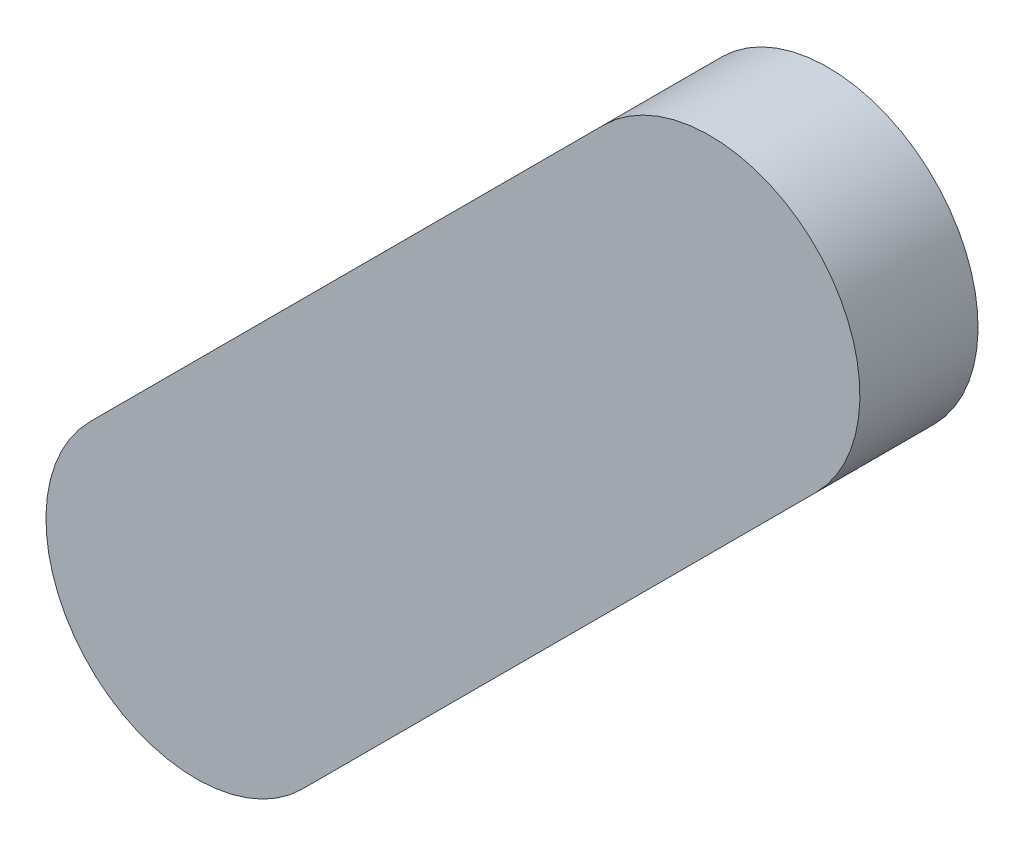
ISO-10303-21;
HEADER;
FILE_DESCRIPTION(('STEP AP214'),'2;1');
FILE_NAME('part.step','',(''),(''),'','','');
FILE_SCHEMA(('AUTOMOTIVE_DESIGN { 1 0 10303 214 1 1 1 1 }'));
ENDSEC;
DATA;
#1=APPLICATION_CONTEXT('core data for automotive mechanical design processes');
#2=APPLICATION_PROTOCOL_DEFINITION('international standard','automotive_design',2000,#1);
#3=PRODUCT_CONTEXT('',#1,'mechanical');
#4=PRODUCT('Part','Part','',(#3));
#5=PRODUCT_RELATED_PRODUCT_CATEGORY('part','',(#4));
#6=PRODUCT_DEFINITION_FORMATION('','',#4);
#7=PRODUCT_DEFINITION_CONTEXT('part definition',#1,'design');
#8=PRODUCT_DEFINITION('design','',#6,#7);
#9=PRODUCT_DEFINITION_SHAPE('','',#8);
#10=(LENGTH_UNIT() NAMED_UNIT(*) SI_UNIT(.MILLI.,.METRE.));
#11=(NAMED_UNIT(*) PLANE_ANGLE_UNIT() SI_UNIT($,.RADIAN.));
#12=(NAMED_UNIT(*) SI_UNIT($,.STERADIAN.) SOLID_ANGLE_UNIT());
#13=UNCERTAINTY_MEASURE_WITH_UNIT(LENGTH_MEASURE(1.E-05),#10,'distance_accuracy_value','');
#14=(GEOMETRIC_REPRESENTATION_CONTEXT(3) GLOBAL_UNCERTAINTY_ASSIGNED_CONTEXT((#13)) GLOBAL_UNIT_ASSIGNED_CONTEXT((#10,
#11,#12)) REPRESENTATION_CONTEXT('',''));
#15=CARTESIAN_POINT('',(0.,0.,0.));
#16=DIRECTION('',(0.,0.,1.));
#17=DIRECTION('',(1.,0.,0.));
#18=AXIS2_PLACEMENT_3D('',#15,#16,#17);
#19=CARTESIAN_POINT('',(108.76460594,57.98639406,0.));
#20=DIRECTION('',(-0.707106781186545,0.707106781186551,0.));
#21=DIRECTION('',(0.707106781186551,0.707106781186545,0.));
#22=AXIS2_PLACEMENT_3D('',#19,#20,#21);
#23=PLANE('',#22);
#24=DIRECTION('',(0.707106781186551,0.707106781186545,0.));
#25=VECTOR('',#24,1.);
#26=CARTESIAN_POINT('',(108.76460594,57.98639406,0.1999996));
#27=LINE('',#26,#25);
#28=CARTESIAN_POINT('',(108.76460594,57.98639406,0.1999996));
#29=VERTEX_POINT('',#28);
#30=CARTESIAN_POINT('',(109.63460674,58.85639486,0.1999996));
#31=VERTEX_POINT('',#30);
#32=EDGE_CURVE('E11',#29,#31,#27,.T.);
#33=ORIENTED_EDGE('',*,*,#32,.F.);
#34=DIRECTION('',(0.,0.,1.));
#35=VECTOR('',#34,1.);
#36=CARTESIAN_POINT('',(108.76460594,57.98639406,0.));
#37=LINE('',#36,#35);
#38=CARTESIAN_POINT('',(108.76460594,57.98639406,0.));
#39=VERTEX_POINT('',#38);
#40=EDGE_CURVE('E24',#39,#29,#37,.T.);
#41=ORIENTED_EDGE('',*,*,#40,.F.);
#42=DIRECTION('',(0.707106781186551,0.707106781186545,0.));
#43=VECTOR('',#42,1.);
#44=CARTESIAN_POINT('',(108.76460594,57.98639406,0.));
#45=LINE('',#44,#43);
#46=CARTESIAN_POINT('',(109.63460674,58.85639486,0.));
#47=VERTEX_POINT('',#46);
#48=EDGE_CURVE('E75',#39,#47,#45,.T.);
#49=ORIENTED_EDGE('',*,*,#48,.T.);
#50=DIRECTION('',(0.,0.,1.));
#51=VECTOR('',#50,1.);
#52=CARTESIAN_POINT('',(109.63460674,58.85639486,0.));
#53=LINE('',#52,#51);
#54=EDGE_CURVE('E37',#47,#31,#53,.T.);
#55=ORIENTED_EDGE('',*,*,#54,.T.);
#56=EDGE_LOOP('',(#33,#41,#49,#55));
#57=FACE_BOUND('',#56,.T.);
#58=ADVANCED_FACE('F17',(#57),#23,.F.);
#59=CARTESIAN_POINT('',(109.4550008,59.0360008,0.));
#60=DIRECTION('',(0.,0.,-1.));
#61=DIRECTION('',(0.707106781186562,-0.707106781186534,0.));
#62=AXIS2_PLACEMENT_3D('',#59,#60,#61);
#63=CYLINDRICAL_SURFACE('',#62,0.254001156230766);
#64=CARTESIAN_POINT('',(109.4550008,59.0360008,0.1999996));
#65=DIRECTION('',(0.,0.,1.));
#66=DIRECTION('',(0.707106781186562,-0.707106781186534,0.));
#67=AXIS2_PLACEMENT_3D('',#64,#65,#66);
#68=CIRCLE('',#67,0.254001156230766);
#69=CARTESIAN_POINT('',(109.27539486,59.21560674,0.1999996));
#70=VERTEX_POINT('',#69);
#71=EDGE_CURVE('E83',#31,#70,#68,.T.);
#72=ORIENTED_EDGE('',*,*,#71,.F.);
#73=ORIENTED_EDGE('',*,*,#54,.F.);
#74=CARTESIAN_POINT('',(109.4550008,59.0360008,0.));
#75=DIRECTION('',(0.,0.,1.));
#76=DIRECTION('',(0.707106781186562,-0.707106781186534,0.));
#77=AXIS2_PLACEMENT_3D('',#74,#75,#76);
#78=CIRCLE('',#77,0.254001156230766);
#79=CARTESIAN_POINT('',(109.27539486,59.21560674,0.));
#80=VERTEX_POINT('',#79);
#81=EDGE_CURVE('E81',#47,#80,#78,.T.);
#82=ORIENTED_EDGE('',*,*,#81,.T.);
#83=DIRECTION('',(0.,0.,1.));
#84=VECTOR('',#83,1.);
#85=CARTESIAN_POINT('',(109.27539486,59.21560674,0.));
#86=LINE('',#85,#84);
#87=EDGE_CURVE('E67',#80,#70,#86,.T.);
#88=ORIENTED_EDGE('',*,*,#87,.T.);
#89=EDGE_LOOP('',(#72,#73,#82,#88));
#90=FACE_BOUND('',#89,.T.);
#91=ADVANCED_FACE('F89',(#90),#63,.T.);
#92=CARTESIAN_POINT('',(109.27539486,59.21560674,0.));
#93=DIRECTION('',(0.707106781186536,-0.707106781186559,0.));
#94=DIRECTION('',(-0.707106781186559,-0.707106781186536,0.));
#95=AXIS2_PLACEMENT_3D('',#92,#93,#94);
#96=PLANE('',#95);
#97=DIRECTION('',(-0.707106781186559,-0.707106781186536,0.));
#98=VECTOR('',#97,1.);
#99=CARTESIAN_POINT('',(109.27539486,59.21560674,0.1999996));
#100=LINE('',#99,#98);
#101=CARTESIAN_POINT('',(108.40539406,58.34560594,0.1999996));
#102=VERTEX_POINT('',#101);
#103=EDGE_CURVE('E71',#70,#102,#100,.T.);
#104=ORIENTED_EDGE('',*,*,#103,.F.);
#105=ORIENTED_EDGE('',*,*,#87,.F.);
#106=DIRECTION('',(-0.707106781186559,-0.707106781186536,0.));
#107=VECTOR('',#106,1.);
#108=CARTESIAN_POINT('',(109.27539486,59.21560674,0.));
#109=LINE('',#108,#107);
#110=CARTESIAN_POINT('',(108.40539406,58.34560594,0.));
#111=VERTEX_POINT('',#110);
#112=EDGE_CURVE('E63',#80,#111,#109,.T.);
#113=ORIENTED_EDGE('',*,*,#112,.T.);
#114=DIRECTION('',(0.,0.,1.));
#115=VECTOR('',#114,1.);
#116=CARTESIAN_POINT('',(108.40539406,58.34560594,0.));
#117=LINE('',#116,#115);
#118=EDGE_CURVE('E53',#111,#102,#117,.T.);
#119=ORIENTED_EDGE('',*,*,#118,.T.);
#120=EDGE_LOOP('',(#104,#105,#113,#119));
#121=FACE_BOUND('',#120,.T.);
#122=ADVANCED_FACE('F66',(#121),#96,.F.);
#123=CARTESIAN_POINT('',(108.585,58.166,0.));
#124=DIRECTION('',(0.,0.,-1.));
#125=DIRECTION('',(-0.707106781186534,0.707106781186562,0.));
#126=AXIS2_PLACEMENT_3D('',#123,#124,#125);
#127=CYLINDRICAL_SURFACE('',#126,0.254001156230773);
#128=CARTESIAN_POINT('',(108.585,58.166,0.1999996));
#129=DIRECTION('',(0.,0.,1.));
#130=DIRECTION('',(-0.707106781186534,0.707106781186562,0.));
#131=AXIS2_PLACEMENT_3D('',#128,#129,#130);
#132=CIRCLE('',#131,0.254001156230773);
#133=EDGE_CURVE('E59',#102,#29,#132,.T.);
#134=ORIENTED_EDGE('',*,*,#133,.F.);
#135=ORIENTED_EDGE('',*,*,#118,.F.);
#136=CARTESIAN_POINT('',(108.585,58.166,0.));
#137=DIRECTION('',(0.,0.,1.));
#138=DIRECTION('',(-0.707106781186534,0.707106781186562,0.));
#139=AXIS2_PLACEMENT_3D('',#136,#137,#138);
#140=CIRCLE('',#139,0.254001156230773);
#141=EDGE_CURVE('E57',#111,#39,#140,.T.);
#142=ORIENTED_EDGE('',*,*,#141,.T.);
#143=ORIENTED_EDGE('',*,*,#40,.T.);
#144=EDGE_LOOP('',(#134,#135,#142,#143));
#145=FACE_BOUND('',#144,.T.);
#146=ADVANCED_FACE('F55',(#145),#127,.T.);
#147=CARTESIAN_POINT('',(108.76460594,57.98639406,0.));
#148=DIRECTION('',(0.,0.,-1.));
#149=DIRECTION('',(-1.,0.,0.));
#150=AXIS2_PLACEMENT_3D('',#147,#148,#149);
#151=PLANE('',#150);
#152=ORIENTED_EDGE('',*,*,#141,.F.);
#153=ORIENTED_EDGE('',*,*,#112,.F.);
#154=ORIENTED_EDGE('',*,*,#81,.F.);
#155=ORIENTED_EDGE('',*,*,#48,.F.);
#156=EDGE_LOOP('',(#152,#153,#154,#155));
#157=FACE_BOUND('',#156,.T.);
#158=ADVANCED_FACE('F74',(#157),#151,.T.);
#159=CARTESIAN_POINT('',(108.76460594,57.98639406,0.1999996));
#160=DIRECTION('',(0.,0.,-1.));
#161=DIRECTION('',(-1.,0.,0.));
#162=AXIS2_PLACEMENT_3D('',#159,#160,#161);
#163=PLANE('',#162);
#164=ORIENTED_EDGE('',*,*,#32,.T.);
#165=ORIENTED_EDGE('',*,*,#71,.T.);
#166=ORIENTED_EDGE('',*,*,#103,.T.);
#167=ORIENTED_EDGE('',*,*,#133,.T.);
#168=EDGE_LOOP('',(#164,#165,#166,#167));
#169=FACE_BOUND('',#168,.T.);
#170=ADVANCED_FACE('F91',(#169),#163,.F.);
#171=CLOSED_SHELL('',(#58,#91,#122,#146,#158,#170));
#172=MANIFOLD_SOLID_BREP('B1',#171);
#173=ADVANCED_BREP_SHAPE_REPRESENTATION('',(#18,#172),#14);
#174=SHAPE_DEFINITION_REPRESENTATION(#9,#173);
ENDSEC;
END-ISO-10303-21;
